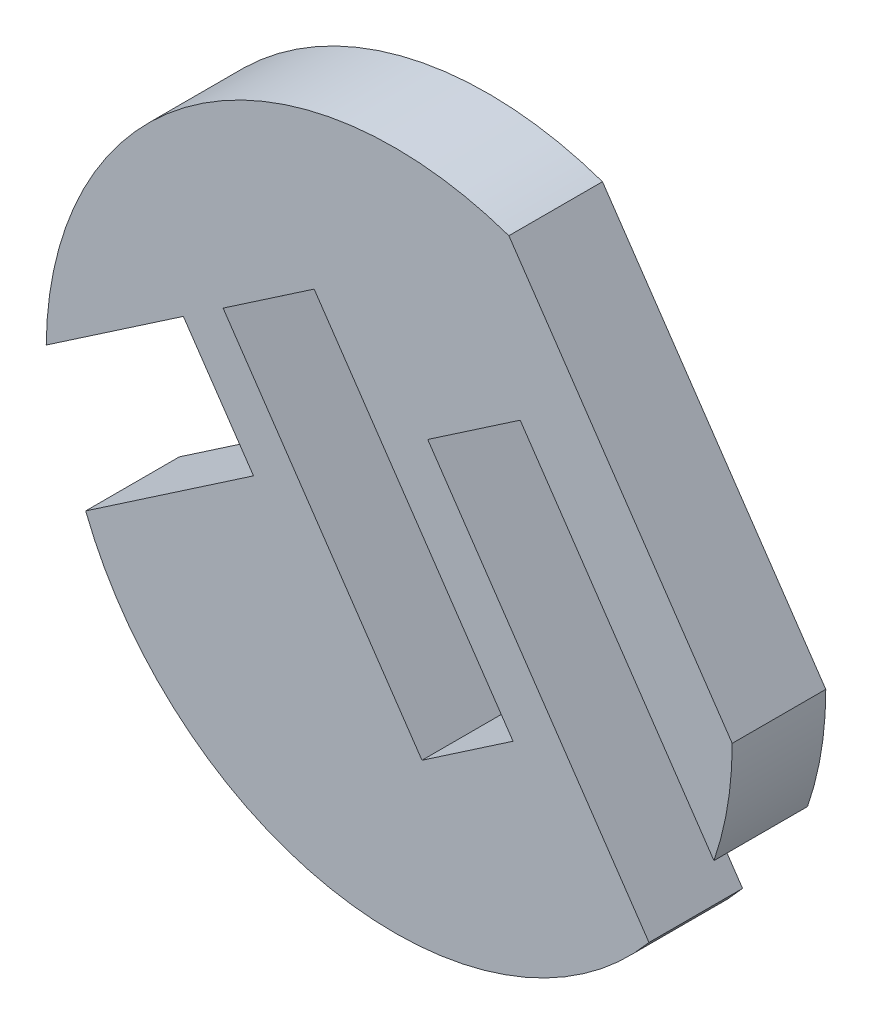
ISO-10303-21;
HEADER;
FILE_DESCRIPTION(('STEP AP214'),'2;1');
FILE_NAME('part.step','',(''),(''),'','','');
FILE_SCHEMA(('AUTOMOTIVE_DESIGN { 1 0 10303 214 1 1 1 1 }'));
ENDSEC;
DATA;
#1=APPLICATION_CONTEXT('core data for automotive mechanical design processes');
#2=APPLICATION_PROTOCOL_DEFINITION('international standard','automotive_design',2000,#1);
#3=PRODUCT_CONTEXT('',#1,'mechanical');
#4=PRODUCT('Part','Part','',(#3));
#5=PRODUCT_RELATED_PRODUCT_CATEGORY('part','',(#4));
#6=PRODUCT_DEFINITION_FORMATION('','',#4);
#7=PRODUCT_DEFINITION_CONTEXT('part definition',#1,'design');
#8=PRODUCT_DEFINITION('design','',#6,#7);
#9=PRODUCT_DEFINITION_SHAPE('','',#8);
#10=(LENGTH_UNIT() NAMED_UNIT(*) SI_UNIT(.MILLI.,.METRE.));
#11=(NAMED_UNIT(*) PLANE_ANGLE_UNIT() SI_UNIT($,.RADIAN.));
#12=(NAMED_UNIT(*) SI_UNIT($,.STERADIAN.) SOLID_ANGLE_UNIT());
#13=UNCERTAINTY_MEASURE_WITH_UNIT(LENGTH_MEASURE(1.E-05),#10,'distance_accuracy_value','');
#14=(GEOMETRIC_REPRESENTATION_CONTEXT(3) GLOBAL_UNCERTAINTY_ASSIGNED_CONTEXT((#13)) GLOBAL_UNIT_ASSIGNED_CONTEXT((#10,
#11,#12)) REPRESENTATION_CONTEXT('',''));
#15=CARTESIAN_POINT('',(0.,0.,0.));
#16=DIRECTION('',(0.,0.,1.));
#17=DIRECTION('',(1.,0.,0.));
#18=AXIS2_PLACEMENT_3D('',#15,#16,#17);
#19=CARTESIAN_POINT('',(0.0004583703082406,-0.430086957464,0.));
#20=DIRECTION('',(0.,0.,1.));
#21=DIRECTION('',(1.,0.,0.));
#22=AXIS2_PLACEMENT_3D('',#19,#20,#21);
#23=PLANE('',#22);
#24=DIRECTION('',(-0.562790995256208,0.826599235215305,0.));
#25=VECTOR('',#24,1.);
#26=CARTESIAN_POINT('',(0.112894151054,-0.562880991821,0.));
#27=LINE('',#26,#25);
#28=CARTESIAN_POINT('',(0.112894151053928,-0.562880991820895,0.));
#29=VERTEX_POINT('',#28);
#30=CARTESIAN_POINT('',(-0.0996465562221686,-0.250711842763006,0.));
#31=VERTEX_POINT('',#30);
#32=EDGE_CURVE('E224',#29,#31,#27,.T.);
#33=ORIENTED_EDGE('',*,*,#32,.T.);
#34=DIRECTION('',(-0.826599235215305,-0.562790995256208,0.));
#35=VECTOR('',#34,1.);
#36=CARTESIAN_POINT('',(-0.09964655622216,-0.250711842763,0.));
#37=LINE('',#36,#35);
#38=CARTESIAN_POINT('',(-0.196957878160988,-0.316966362959018,0.));
#39=VERTEX_POINT('',#38);
#40=EDGE_CURVE('E231',#31,#39,#37,.T.);
#41=ORIENTED_EDGE('',*,*,#40,.T.);
#42=DIRECTION('',(0.562790995256208,-0.826599235215305,0.));
#43=VECTOR('',#42,1.);
#44=CARTESIAN_POINT('',(-0.196957878161,-0.316966362959,0.));
#45=LINE('',#44,#43);
#46=CARTESIAN_POINT('',(0.0155828291149198,-0.629135512016959,0.));
#47=VERTEX_POINT('',#46);
#48=EDGE_CURVE('E236',#39,#47,#45,.T.);
#49=ORIENTED_EDGE('',*,*,#48,.T.);
#50=DIRECTION('',(0.826599235215305,0.562790995256208,0.));
#51=VECTOR('',#50,1.);
#52=CARTESIAN_POINT('',(0.01558282911486,-0.629135512017,0.));
#53=LINE('',#52,#51);
#54=EDGE_CURVE('E241',#47,#29,#53,.T.);
#55=ORIENTED_EDGE('',*,*,#54,.T.);
#56=EDGE_LOOP('',(#33,#41,#49,#55));
#57=FACE_BOUND('',#56,.T.);
#58=CARTESIAN_POINT('',(-0.01366546458252,-0.448973142253,0.));
#59=DIRECTION('',(0.,0.,1.));
#60=DIRECTION('',(1.,0.,0.));
#61=AXIS2_PLACEMENT_3D('',#58,#59,#60);
#62=CIRCLE('',#61,0.360752550993);
#63=CARTESIAN_POINT('',(0.327571462128343,-0.566019128501491,0.));
#64=VERTEX_POINT('',#63);
#65=CARTESIAN_POINT('',(0.347085017117282,-0.447751257922207,0.));
#66=VERTEX_POINT('',#65);
#67=EDGE_CURVE('E187',#64,#66,#62,.T.);
#68=ORIENTED_EDGE('',*,*,#67,.F.);
#69=DIRECTION('',(0.562790995256208,-0.826599235215305,0.));
#70=VECTOR('',#69,1.);
#71=CARTESIAN_POINT('',(0.120528554681,-0.261924872561,0.));
#72=LINE('',#71,#70);
#73=CARTESIAN_POINT('',(0.120528554681032,-0.261924872561046,0.));
#74=VERTEX_POINT('',#73);
#75=EDGE_CURVE('E144',#74,#64,#72,.T.);
#76=ORIENTED_EDGE('',*,*,#75,.F.);
#77=DIRECTION('',(0.826599235215305,0.562790995256208,0.));
#78=VECTOR('',#77,1.);
#79=CARTESIAN_POINT('',(0.02172455107116,-0.329195686709,0.));
#80=LINE('',#79,#78);
#81=CARTESIAN_POINT('',(0.021724551071214,-0.329195686708963,0.));
#82=VERTEX_POINT('',#81);
#83=EDGE_CURVE('E152',#82,#74,#80,.T.);
#84=ORIENTED_EDGE('',*,*,#83,.F.);
#85=DIRECTION('',(-0.562790995256208,0.826599235215305,0.));
#86=VECTOR('',#85,1.);
#87=CARTESIAN_POINT('',(0.258172625164,-0.676478779119,0.));
#88=LINE('',#87,#86);
#89=CARTESIAN_POINT('',(0.258172625163906,-0.676478779118862,0.));
#90=VERTEX_POINT('',#89);
#91=EDGE_CURVE('E158',#90,#82,#88,.T.);
#92=ORIENTED_EDGE('',*,*,#91,.F.);
#93=CARTESIAN_POINT('',(-0.01366546458252,-0.448973142253,0.));
#94=DIRECTION('',(0.,0.,1.));
#95=DIRECTION('',(1.,0.,0.));
#96=AXIS2_PLACEMENT_3D('',#93,#94,#95);
#97=CIRCLE('',#96,0.354478154253);
#98=CARTESIAN_POINT('',(-0.343801956336065,-0.578064809897643,0.));
#99=VERTEX_POINT('',#98);
#100=EDGE_CURVE('E190',#99,#90,#97,.T.);
#101=ORIENTED_EDGE('',*,*,#100,.F.);
#102=DIRECTION('',(-0.826599235215305,-0.562790995256208,0.));
#103=VECTOR('',#102,1.);
#104=CARTESIAN_POINT('',(-0.164452146119,-0.455954295042,0.));
#105=LINE('',#104,#103);
#106=CARTESIAN_POINT('',(-0.164452146118928,-0.455954295041951,0.));
#107=VERTEX_POINT('',#106);
#108=EDGE_CURVE('E164',#107,#99,#105,.T.);
#109=ORIENTED_EDGE('',*,*,#108,.F.);
#110=DIRECTION('',(0.562790995256208,-0.826599235215305,0.));
#111=VECTOR('',#110,1.);
#112=CARTESIAN_POINT('',(-0.239405355285,-0.345866774282,0.));
#113=LINE('',#112,#111);
#114=CARTESIAN_POINT('',(-0.239405355285008,-0.345866774281989,0.));
#115=VERTEX_POINT('',#114);
#116=EDGE_CURVE('E119',#115,#107,#113,.T.);
#117=ORIENTED_EDGE('',*,*,#116,.F.);
#118=DIRECTION('',(0.826599235215305,0.562790995256208,0.));
#119=VECTOR('',#118,1.);
#120=CARTESIAN_POINT('',(-0.385959682353,-0.445648448491,0.));
#121=LINE('',#120,#119);
#122=CARTESIAN_POINT('',(-0.385959682352878,-0.445648448490917,0.));
#123=VERTEX_POINT('',#122);
#124=EDGE_CURVE('E117',#123,#115,#121,.T.);
#125=ORIENTED_EDGE('',*,*,#124,.F.);
#126=CARTESIAN_POINT('',(-0.01366546458252,-0.448973142253,0.));
#127=DIRECTION('',(0.,0.,1.));
#128=DIRECTION('',(1.,0.,0.));
#129=AXIS2_PLACEMENT_3D('',#126,#127,#128);
#130=CIRCLE('',#129,0.372309062707);
#131=CARTESIAN_POINT('',(0.108453842166029,-0.0972617362778473,0.));
#132=VERTEX_POINT('',#131);
#133=EDGE_CURVE('E20',#132,#123,#130,.T.);
#134=ORIENTED_EDGE('',*,*,#133,.F.);
#135=DIRECTION('',(-0.562790995256208,0.826599235215305,0.));
#136=VECTOR('',#135,1.);
#137=CARTESIAN_POINT('',(0.347085017117,-0.447751257922,0.));
#138=LINE('',#137,#136);
#139=EDGE_CURVE('E131',#66,#132,#138,.T.);
#140=ORIENTED_EDGE('',*,*,#139,.F.);
#141=EDGE_LOOP('',(#68,#76,#84,#92,#101,#109,#117,#125,#134,#140));
#142=FACE_BOUND('',#141,.T.);
#143=ADVANCED_FACE('F17',(#57,#142),#23,.F.);
#144=CARTESIAN_POINT('',(0.347085017117,-0.447751257922,0.));
#145=DIRECTION('',(0.826599235215305,0.562790995256208,0.));
#146=DIRECTION('',(-0.562790995256208,0.826599235215305,0.));
#147=AXIS2_PLACEMENT_3D('',#144,#145,#146);
#148=PLANE('',#147);
#149=DIRECTION('',(-0.56279099525628,0.826599235215256,0.));
#150=VECTOR('',#149,1.);
#151=CARTESIAN_POINT('',(0.347085017117,-0.447751257922,0.1));
#152=LINE('',#151,#150);
#153=CARTESIAN_POINT('',(0.347085017117282,-0.447751257922207,0.1));
#154=VERTEX_POINT('',#153);
#155=CARTESIAN_POINT('',(0.108453842165999,-0.0972617362778371,0.1));
#156=VERTEX_POINT('',#155);
#157=EDGE_CURVE('E186',#154,#156,#152,.T.);
#158=ORIENTED_EDGE('',*,*,#157,.F.);
#159=DIRECTION('',(0.,0.,1.));
#160=VECTOR('',#159,1.);
#161=CARTESIAN_POINT('',(0.347085017117281,-0.447751257921999,0.));
#162=LINE('',#161,#160);
#163=EDGE_CURVE('E189',#66,#154,#162,.T.);
#164=ORIENTED_EDGE('',*,*,#163,.F.);
#165=ORIENTED_EDGE('',*,*,#139,.T.);
#166=DIRECTION('',(0.,0.,1.));
#167=VECTOR('',#166,1.);
#168=CARTESIAN_POINT('',(0.108453842166001,-0.0972617362778377,0.));
#169=LINE('',#168,#167);
#170=EDGE_CURVE('E124',#156,#132,#169,.F.);
#171=ORIENTED_EDGE('',*,*,#170,.F.);
#172=EDGE_LOOP('',(#158,#164,#165,#171));
#173=FACE_BOUND('',#172,.T.);
#174=ADVANCED_FACE('F410',(#173),#148,.T.);
#175=CARTESIAN_POINT('',(-0.01366546458252,-0.448973142253,0.));
#176=DIRECTION('',(0.,0.,1.));
#177=DIRECTION('',(1.,0.,0.));
#178=AXIS2_PLACEMENT_3D('',#175,#176,#177);
#179=CYLINDRICAL_SURFACE('',#178,0.372309062707);
#180=CARTESIAN_POINT('',(-0.01366546458252,-0.448973142253,0.1));
#181=DIRECTION('',(0.,0.,1.));
#182=DIRECTION('',(1.,0.,0.));
#183=AXIS2_PLACEMENT_3D('',#180,#181,#182);
#184=CIRCLE('',#183,0.372309062707);
#185=CARTESIAN_POINT('',(-0.385959682352878,-0.445648448490917,0.1));
#186=VERTEX_POINT('',#185);
#187=EDGE_CURVE('E184',#156,#186,#184,.T.);
#188=ORIENTED_EDGE('',*,*,#187,.F.);
#189=ORIENTED_EDGE('',*,*,#170,.T.);
#190=ORIENTED_EDGE('',*,*,#133,.T.);
#191=DIRECTION('',(0.,0.,1.));
#192=VECTOR('',#191,1.);
#193=CARTESIAN_POINT('',(-0.385959682353,-0.445648448491,0.));
#194=LINE('',#193,#192);
#195=EDGE_CURVE('E123',#186,#123,#194,.F.);
#196=ORIENTED_EDGE('',*,*,#195,.F.);
#197=EDGE_LOOP('',(#188,#189,#190,#196));
#198=FACE_BOUND('',#197,.T.);
#199=ADVANCED_FACE('F129',(#198),#179,.T.);
#200=CARTESIAN_POINT('',(-0.385959682353,-0.445648448491,0.));
#201=DIRECTION('',(0.562790995256208,-0.826599235215305,0.));
#202=DIRECTION('',(0.826599235215305,0.562790995256208,0.));
#203=AXIS2_PLACEMENT_3D('',#200,#201,#202);
#204=PLANE('',#203);
#205=DIRECTION('',(0.826599235215436,0.562790995256015,0.));
#206=VECTOR('',#205,1.);
#207=CARTESIAN_POINT('',(-0.385959682353,-0.445648448491,0.1));
#208=LINE('',#207,#206);
#209=CARTESIAN_POINT('',(-0.239405355285,-0.345866774282,0.1));
#210=VERTEX_POINT('',#209);
#211=EDGE_CURVE('E134',#186,#210,#208,.T.);
#212=ORIENTED_EDGE('',*,*,#211,.F.);
#213=ORIENTED_EDGE('',*,*,#195,.T.);
#214=ORIENTED_EDGE('',*,*,#124,.T.);
#215=DIRECTION('',(0.,0.,1.));
#216=VECTOR('',#215,1.);
#217=CARTESIAN_POINT('',(-0.239405355285,-0.345866774282,0.));
#218=LINE('',#217,#216);
#219=EDGE_CURVE('E137',#210,#115,#218,.F.);
#220=ORIENTED_EDGE('',*,*,#219,.F.);
#221=EDGE_LOOP('',(#212,#213,#214,#220));
#222=FACE_BOUND('',#221,.T.);
#223=ADVANCED_FACE('F132',(#222),#204,.T.);
#224=CARTESIAN_POINT('',(-0.239405355285,-0.345866774282,0.));
#225=DIRECTION('',(-0.826599235215305,-0.562790995256208,0.));
#226=DIRECTION('',(0.562790995256208,-0.826599235215305,0.));
#227=AXIS2_PLACEMENT_3D('',#224,#225,#226);
#228=PLANE('',#227);
#229=DIRECTION('',(0.562790995254591,-0.826599235216406,0.));
#230=VECTOR('',#229,1.);
#231=CARTESIAN_POINT('',(-0.239405355285,-0.345866774282,0.1));
#232=LINE('',#231,#230);
#233=CARTESIAN_POINT('',(-0.164452146119,-0.455954295042,0.1));
#234=VERTEX_POINT('',#233);
#235=EDGE_CURVE('E204',#210,#234,#232,.T.);
#236=ORIENTED_EDGE('',*,*,#235,.F.);
#237=ORIENTED_EDGE('',*,*,#219,.T.);
#238=ORIENTED_EDGE('',*,*,#116,.T.);
#239=DIRECTION('',(0.,0.,1.));
#240=VECTOR('',#239,1.);
#241=CARTESIAN_POINT('',(-0.164452146119,-0.455954295042,0.));
#242=LINE('',#241,#240);
#243=EDGE_CURVE('E167',#234,#107,#242,.F.);
#244=ORIENTED_EDGE('',*,*,#243,.F.);
#245=EDGE_LOOP('',(#236,#237,#238,#244));
#246=FACE_BOUND('',#245,.T.);
#247=ADVANCED_FACE('F210',(#246),#228,.T.);
#248=CARTESIAN_POINT('',(-0.164452146119,-0.455954295042,0.));
#249=DIRECTION('',(-0.562790995256208,0.826599235215305,0.));
#250=DIRECTION('',(-0.826599235215305,-0.562790995256208,0.));
#251=AXIS2_PLACEMENT_3D('',#248,#249,#250);
#252=PLANE('',#251);
#253=DIRECTION('',(-0.826599235213543,-0.562790995258795,0.));
#254=VECTOR('',#253,1.);
#255=CARTESIAN_POINT('',(-0.164452146119,-0.455954295042,0.1));
#256=LINE('',#255,#254);
#257=CARTESIAN_POINT('',(-0.343801956335939,-0.578064809897967,0.1));
#258=VERTEX_POINT('',#257);
#259=EDGE_CURVE('E183',#234,#258,#256,.T.);
#260=ORIENTED_EDGE('',*,*,#259,.F.);
#261=ORIENTED_EDGE('',*,*,#243,.T.);
#262=ORIENTED_EDGE('',*,*,#108,.T.);
#263=DIRECTION('',(0.,0.,1.));
#264=VECTOR('',#263,1.);
#265=CARTESIAN_POINT('',(-0.343801956335936,-0.578064809897975,0.));
#266=LINE('',#265,#264);
#267=EDGE_CURVE('E161',#258,#99,#266,.F.);
#268=ORIENTED_EDGE('',*,*,#267,.F.);
#269=EDGE_LOOP('',(#260,#261,#262,#268));
#270=FACE_BOUND('',#269,.T.);
#271=ADVANCED_FACE('F381',(#270),#252,.T.);
#272=CARTESIAN_POINT('',(-0.01366546458252,-0.448973142253,0.));
#273=DIRECTION('',(0.,0.,1.));
#274=DIRECTION('',(1.,0.,0.));
#275=AXIS2_PLACEMENT_3D('',#272,#273,#274);
#276=CYLINDRICAL_SURFACE('',#275,0.354478154253);
#277=CARTESIAN_POINT('',(-0.01366546458252,-0.448973142253,0.1));
#278=DIRECTION('',(0.,0.,1.));
#279=DIRECTION('',(1.,0.,0.));
#280=AXIS2_PLACEMENT_3D('',#277,#278,#279);
#281=CIRCLE('',#280,0.354478154253);
#282=CARTESIAN_POINT('',(0.258172625163906,-0.676478779118862,0.1));
#283=VERTEX_POINT('',#282);
#284=EDGE_CURVE('E179',#258,#283,#281,.T.);
#285=ORIENTED_EDGE('',*,*,#284,.F.);
#286=ORIENTED_EDGE('',*,*,#267,.T.);
#287=ORIENTED_EDGE('',*,*,#100,.T.);
#288=DIRECTION('',(0.,0.,1.));
#289=VECTOR('',#288,1.);
#290=CARTESIAN_POINT('',(0.258172625164,-0.676478779119,0.));
#291=LINE('',#290,#289);
#292=EDGE_CURVE('E155',#283,#90,#291,.F.);
#293=ORIENTED_EDGE('',*,*,#292,.F.);
#294=EDGE_LOOP('',(#285,#286,#287,#293));
#295=FACE_BOUND('',#294,.T.);
#296=ADVANCED_FACE('F265',(#295),#276,.T.);
#297=CARTESIAN_POINT('',(0.258172625164,-0.676478779119,0.));
#298=DIRECTION('',(0.826599235215305,0.562790995256208,0.));
#299=DIRECTION('',(-0.562790995256208,0.826599235215305,0.));
#300=AXIS2_PLACEMENT_3D('',#297,#298,#299);
#301=PLANE('',#300);
#302=DIRECTION('',(-0.562790995256593,0.826599235215043,0.));
#303=VECTOR('',#302,1.);
#304=CARTESIAN_POINT('',(0.258172625164,-0.676478779119,0.1));
#305=LINE('',#304,#303);
#306=CARTESIAN_POINT('',(0.02172455107116,-0.329195686709,0.1));
#307=VERTEX_POINT('',#306);
#308=EDGE_CURVE('E182',#283,#307,#305,.T.);
#309=ORIENTED_EDGE('',*,*,#308,.F.);
#310=ORIENTED_EDGE('',*,*,#292,.T.);
#311=ORIENTED_EDGE('',*,*,#91,.T.);
#312=DIRECTION('',(0.,0.,1.));
#313=VECTOR('',#312,1.);
#314=CARTESIAN_POINT('',(0.02172455107116,-0.329195686709,0.));
#315=LINE('',#314,#313);
#316=EDGE_CURVE('E148',#307,#82,#315,.F.);
#317=ORIENTED_EDGE('',*,*,#316,.F.);
#318=EDGE_LOOP('',(#309,#310,#311,#317));
#319=FACE_BOUND('',#318,.T.);
#320=ADVANCED_FACE('F262',(#319),#301,.T.);
#321=CARTESIAN_POINT('',(0.02172455107116,-0.329195686709,0.));
#322=DIRECTION('',(0.562790995256208,-0.826599235215305,0.));
#323=DIRECTION('',(0.826599235215305,0.562790995256208,0.));
#324=AXIS2_PLACEMENT_3D('',#321,#322,#323);
#325=PLANE('',#324);
#326=DIRECTION('',(0.826599235214514,0.562790995257369,0.));
#327=VECTOR('',#326,1.);
#328=CARTESIAN_POINT('',(0.02172455107116,-0.329195686709,0.1));
#329=LINE('',#328,#327);
#330=CARTESIAN_POINT('',(0.120528554681,-0.261924872561,0.1));
#331=VERTEX_POINT('',#330);
#332=EDGE_CURVE('E252',#307,#331,#329,.T.);
#333=ORIENTED_EDGE('',*,*,#332,.F.);
#334=ORIENTED_EDGE('',*,*,#316,.T.);
#335=ORIENTED_EDGE('',*,*,#83,.T.);
#336=DIRECTION('',(0.,0.,1.));
#337=VECTOR('',#336,1.);
#338=CARTESIAN_POINT('',(0.120528554681,-0.261924872561,0.));
#339=LINE('',#338,#337);
#340=EDGE_CURVE('E147',#331,#74,#339,.F.);
#341=ORIENTED_EDGE('',*,*,#340,.F.);
#342=EDGE_LOOP('',(#333,#334,#335,#341));
#343=FACE_BOUND('',#342,.T.);
#344=ADVANCED_FACE('F357',(#343),#325,.T.);
#345=CARTESIAN_POINT('',(0.120528554681,-0.261924872561,0.));
#346=DIRECTION('',(-0.826599235215305,-0.562790995256208,0.));
#347=DIRECTION('',(0.562790995256208,-0.826599235215305,0.));
#348=AXIS2_PLACEMENT_3D('',#345,#346,#347);
#349=PLANE('',#348);
#350=DIRECTION('',(0.562790995256825,-0.826599235214885,0.));
#351=VECTOR('',#350,1.);
#352=CARTESIAN_POINT('',(0.120528554681,-0.261924872561,0.1));
#353=LINE('',#352,#351);
#354=CARTESIAN_POINT('',(0.327571462128399,-0.566019128501329,0.1));
#355=VERTEX_POINT('',#354);
#356=EDGE_CURVE('E178',#331,#355,#353,.T.);
#357=ORIENTED_EDGE('',*,*,#356,.F.);
#358=ORIENTED_EDGE('',*,*,#340,.T.);
#359=ORIENTED_EDGE('',*,*,#75,.T.);
#360=DIRECTION('',(0.,0.,1.));
#361=VECTOR('',#360,1.);
#362=CARTESIAN_POINT('',(0.327571462128458,-0.566019128501157,0.));
#363=LINE('',#362,#361);
#364=EDGE_CURVE('E243',#355,#64,#363,.F.);
#365=ORIENTED_EDGE('',*,*,#364,.F.);
#366=EDGE_LOOP('',(#357,#358,#359,#365));
#367=FACE_BOUND('',#366,.T.);
#368=ADVANCED_FACE('F302',(#367),#349,.T.);
#369=CARTESIAN_POINT('',(-0.01366546458252,-0.448973142253,0.));
#370=DIRECTION('',(0.,0.,1.));
#371=DIRECTION('',(1.,0.,0.));
#372=AXIS2_PLACEMENT_3D('',#369,#370,#371);
#373=CYLINDRICAL_SURFACE('',#372,0.360752550993);
#374=CARTESIAN_POINT('',(-0.01366546458252,-0.448973142253,0.1));
#375=DIRECTION('',(0.,0.,1.));
#376=DIRECTION('',(1.,0.,0.));
#377=AXIS2_PLACEMENT_3D('',#374,#375,#376);
#378=CIRCLE('',#377,0.360752550993);
#379=EDGE_CURVE('E174',#355,#154,#378,.T.);
#380=ORIENTED_EDGE('',*,*,#379,.F.);
#381=ORIENTED_EDGE('',*,*,#364,.T.);
#382=ORIENTED_EDGE('',*,*,#67,.T.);
#383=ORIENTED_EDGE('',*,*,#163,.T.);
#384=EDGE_LOOP('',(#380,#381,#382,#383));
#385=FACE_BOUND('',#384,.T.);
#386=ADVANCED_FACE('F294',(#385),#373,.T.);
#387=CARTESIAN_POINT('',(0.01558282911486,-0.629135512017,0.));
#388=DIRECTION('',(0.562790995256208,-0.826599235215305,0.));
#389=DIRECTION('',(0.826599235215305,0.562790995256208,0.));
#390=AXIS2_PLACEMENT_3D('',#387,#388,#389);
#391=PLANE('',#390);
#392=DIRECTION('',(0.,0.,1.));
#393=VECTOR('',#392,1.);
#394=CARTESIAN_POINT('',(0.0155828291150992,-0.629135512016837,0.));
#395=LINE('',#394,#393);
#396=CARTESIAN_POINT('',(0.0155828291149198,-0.629135512016959,0.1));
#397=VERTEX_POINT('',#396);
#398=EDGE_CURVE('E239',#47,#397,#395,.T.);
#399=ORIENTED_EDGE('',*,*,#398,.T.);
#400=DIRECTION('',(-0.826599235216526,-0.562790995254415,0.));
#401=VECTOR('',#400,1.);
#402=CARTESIAN_POINT('',(0.112894151054,-0.562880991821,0.1));
#403=LINE('',#402,#401);
#404=CARTESIAN_POINT('',(0.112894151053928,-0.562880991820895,0.1));
#405=VERTEX_POINT('',#404);
#406=EDGE_CURVE('E177',#405,#397,#403,.T.);
#407=ORIENTED_EDGE('',*,*,#406,.F.);
#408=DIRECTION('',(0.,0.,1.));
#409=VECTOR('',#408,1.);
#410=CARTESIAN_POINT('',(0.112894151054,-0.562880991821,0.));
#411=LINE('',#410,#409);
#412=EDGE_CURVE('E227',#405,#29,#411,.F.);
#413=ORIENTED_EDGE('',*,*,#412,.T.);
#414=ORIENTED_EDGE('',*,*,#54,.F.);
#415=EDGE_LOOP('',(#399,#407,#413,#414));
#416=FACE_BOUND('',#415,.T.);
#417=ADVANCED_FACE('F292',(#416),#391,.F.);
#418=CARTESIAN_POINT('',(-0.196957878161,-0.316966362959,0.));
#419=DIRECTION('',(-0.826599235215305,-0.562790995256208,0.));
#420=DIRECTION('',(0.562790995256208,-0.826599235215305,0.));
#421=AXIS2_PLACEMENT_3D('',#418,#419,#420);
#422=PLANE('',#421);
#423=DIRECTION('',(0.,0.,1.));
#424=VECTOR('',#423,1.);
#425=CARTESIAN_POINT('',(-0.196957878160951,-0.316966362959071,0.));
#426=LINE('',#425,#424);
#427=CARTESIAN_POINT('',(-0.196957878160988,-0.316966362959018,0.1));
#428=VERTEX_POINT('',#427);
#429=EDGE_CURVE('E234',#39,#428,#426,.T.);
#430=ORIENTED_EDGE('',*,*,#429,.T.);
#431=DIRECTION('',(-0.562790995255574,0.826599235215736,0.));
#432=VECTOR('',#431,1.);
#433=CARTESIAN_POINT('',(0.01558282911486,-0.629135512017,0.1));
#434=LINE('',#433,#432);
#435=EDGE_CURVE('E275',#397,#428,#434,.T.);
#436=ORIENTED_EDGE('',*,*,#435,.F.);
#437=ORIENTED_EDGE('',*,*,#398,.F.);
#438=ORIENTED_EDGE('',*,*,#48,.F.);
#439=EDGE_LOOP('',(#430,#436,#437,#438));
#440=FACE_BOUND('',#439,.T.);
#441=ADVANCED_FACE('F284',(#440),#422,.F.);
#442=CARTESIAN_POINT('',(-0.09964655622216,-0.250711842763,0.));
#443=DIRECTION('',(-0.562790995256208,0.826599235215305,0.));
#444=DIRECTION('',(-0.826599235215305,-0.562790995256208,0.));
#445=AXIS2_PLACEMENT_3D('',#442,#443,#444);
#446=PLANE('',#445);
#447=DIRECTION('',(0.,0.,1.));
#448=VECTOR('',#447,1.);
#449=CARTESIAN_POINT('',(-0.0996465562221942,-0.250711842763023,0.));
#450=LINE('',#449,#448);
#451=CARTESIAN_POINT('',(-0.0996465562221686,-0.250711842763006,0.1));
#452=VERTEX_POINT('',#451);
#453=EDGE_CURVE('E35',#31,#452,#450,.T.);
#454=ORIENTED_EDGE('',*,*,#453,.T.);
#455=DIRECTION('',(0.826599235215718,0.562790995255601,0.));
#456=VECTOR('',#455,1.);
#457=CARTESIAN_POINT('',(-0.196957878161,-0.316966362959,0.1));
#458=LINE('',#457,#456);
#459=EDGE_CURVE('E26',#428,#452,#458,.T.);
#460=ORIENTED_EDGE('',*,*,#459,.F.);
#461=ORIENTED_EDGE('',*,*,#429,.F.);
#462=ORIENTED_EDGE('',*,*,#40,.F.);
#463=EDGE_LOOP('',(#454,#460,#461,#462));
#464=FACE_BOUND('',#463,.T.);
#465=ADVANCED_FACE('F282',(#464),#446,.F.);
#466=CARTESIAN_POINT('',(0.112894151054,-0.562880991821,0.));
#467=DIRECTION('',(0.826599235215305,0.562790995256208,0.));
#468=DIRECTION('',(-0.562790995256208,0.826599235215305,0.));
#469=AXIS2_PLACEMENT_3D('',#466,#467,#468);
#470=PLANE('',#469);
#471=ORIENTED_EDGE('',*,*,#412,.F.);
#472=DIRECTION('',(0.562790995256117,-0.826599235215367,0.));
#473=VECTOR('',#472,1.);
#474=CARTESIAN_POINT('',(-0.09964655622216,-0.250711842763,0.1));
#475=LINE('',#474,#473);
#476=EDGE_CURVE('E11',#452,#405,#475,.T.);
#477=ORIENTED_EDGE('',*,*,#476,.F.);
#478=ORIENTED_EDGE('',*,*,#453,.F.);
#479=ORIENTED_EDGE('',*,*,#32,.F.);
#480=EDGE_LOOP('',(#471,#477,#478,#479));
#481=FACE_BOUND('',#480,.T.);
#482=ADVANCED_FACE('F290',(#481),#470,.F.);
#483=CARTESIAN_POINT('',(0.0004583703082406,-0.430086957464,0.1));
#484=DIRECTION('',(0.,0.,1.));
#485=DIRECTION('',(1.,0.,0.));
#486=AXIS2_PLACEMENT_3D('',#483,#484,#485);
#487=PLANE('',#486);
#488=ORIENTED_EDGE('',*,*,#459,.T.);
#489=ORIENTED_EDGE('',*,*,#476,.T.);
#490=ORIENTED_EDGE('',*,*,#406,.T.);
#491=ORIENTED_EDGE('',*,*,#435,.T.);
#492=EDGE_LOOP('',(#488,#489,#490,#491));
#493=FACE_BOUND('',#492,.T.);
#494=ORIENTED_EDGE('',*,*,#356,.T.);
#495=ORIENTED_EDGE('',*,*,#379,.T.);
#496=ORIENTED_EDGE('',*,*,#157,.T.);
#497=ORIENTED_EDGE('',*,*,#187,.T.);
#498=ORIENTED_EDGE('',*,*,#211,.T.);
#499=ORIENTED_EDGE('',*,*,#235,.T.);
#500=ORIENTED_EDGE('',*,*,#259,.T.);
#501=ORIENTED_EDGE('',*,*,#284,.T.);
#502=ORIENTED_EDGE('',*,*,#308,.T.);
#503=ORIENTED_EDGE('',*,*,#332,.T.);
#504=EDGE_LOOP('',(#494,#495,#496,#497,#498,#499,#500,#501,#502,#503));
#505=FACE_BOUND('',#504,.T.);
#506=ADVANCED_FACE('F214',(#493,#505),#487,.T.);
#507=CLOSED_SHELL('',(#143,#174,#199,#223,#247,#271,#296,#320,#344,#368,#386,#417,#441,#465,
#482,#506));
#508=MANIFOLD_SOLID_BREP('B1',#507);
#509=ADVANCED_BREP_SHAPE_REPRESENTATION('',(#18,#508),#14);
#510=SHAPE_DEFINITION_REPRESENTATION(#9,#509);
ENDSEC;
END-ISO-10303-21;
